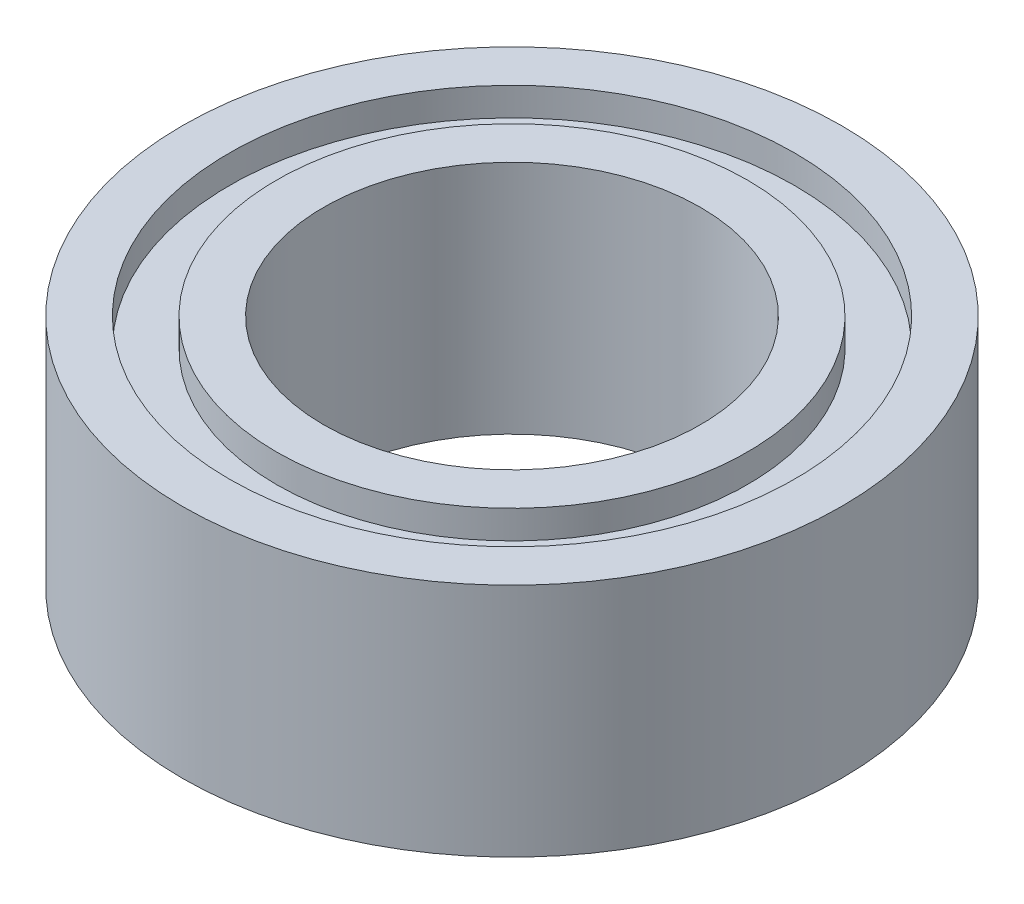
ISO-10303-21;
HEADER;
FILE_DESCRIPTION(('STEP AP214'),'2;1');
FILE_NAME('part.step','',(''),(''),'','','');
FILE_SCHEMA(('AUTOMOTIVE_DESIGN { 1 0 10303 214 1 1 1 1 }'));
ENDSEC;
DATA;
#1=APPLICATION_CONTEXT('core data for automotive mechanical design processes');
#2=APPLICATION_PROTOCOL_DEFINITION('international standard','automotive_design',2000,#1);
#3=PRODUCT_CONTEXT('',#1,'mechanical');
#4=PRODUCT('Part','Part','',(#3));
#5=PRODUCT_RELATED_PRODUCT_CATEGORY('part','',(#4));
#6=PRODUCT_DEFINITION_FORMATION('','',#4);
#7=PRODUCT_DEFINITION_CONTEXT('part definition',#1,'design');
#8=PRODUCT_DEFINITION('design','',#6,#7);
#9=PRODUCT_DEFINITION_SHAPE('','',#8);
#10=(LENGTH_UNIT() NAMED_UNIT(*) SI_UNIT(.MILLI.,.METRE.));
#11=(NAMED_UNIT(*) PLANE_ANGLE_UNIT() SI_UNIT($,.RADIAN.));
#12=(NAMED_UNIT(*) SI_UNIT($,.STERADIAN.) SOLID_ANGLE_UNIT());
#13=UNCERTAINTY_MEASURE_WITH_UNIT(LENGTH_MEASURE(1.E-05),#10,'distance_accuracy_value','');
#14=(GEOMETRIC_REPRESENTATION_CONTEXT(3) GLOBAL_UNCERTAINTY_ASSIGNED_CONTEXT((#13)) GLOBAL_UNIT_ASSIGNED_CONTEXT((#10,
#11,#12)) REPRESENTATION_CONTEXT('',''));
#15=CARTESIAN_POINT('',(0.,0.,0.));
#16=DIRECTION('',(0.,0.,1.));
#17=DIRECTION('',(1.,0.,0.));
#18=AXIS2_PLACEMENT_3D('',#15,#16,#17);
#19=CARTESIAN_POINT('',(2.5,0.,0.));
#20=DIRECTION('',(0.,1.,0.));
#21=DIRECTION('',(0.,0.,1.));
#22=AXIS2_PLACEMENT_3D('',#19,#20,#21);
#23=PLANE('',#22);
#24=CARTESIAN_POINT('',(0.,0.,0.));
#25=DIRECTION('',(0.,1.,0.));
#26=DIRECTION('',(0.,0.,1.));
#27=AXIS2_PLACEMENT_3D('',#24,#25,#26);
#28=CIRCLE('',#27,2.5);
#29=CARTESIAN_POINT('',(0.,0.,2.5));
#30=VERTEX_POINT('',#29);
#31=EDGE_CURVE('E90',#30,#30,#28,.T.);
#32=ORIENTED_EDGE('',*,*,#31,.F.);
#33=EDGE_LOOP('',(#32));
#34=FACE_BOUND('',#33,.T.);
#35=CARTESIAN_POINT('',(0.,0.,0.));
#36=DIRECTION('',(0.,1.,0.));
#37=DIRECTION('',(0.,0.,1.));
#38=AXIS2_PLACEMENT_3D('',#35,#36,#37);
#39=CIRCLE('',#38,2.);
#40=CARTESIAN_POINT('',(0.,0.,2.));
#41=VERTEX_POINT('',#40);
#42=EDGE_CURVE('E10',#41,#41,#39,.T.);
#43=ORIENTED_EDGE('',*,*,#42,.T.);
#44=EDGE_LOOP('',(#43));
#45=FACE_BOUND('',#44,.T.);
#46=ADVANCED_FACE('F39',(#34,#45),#23,.F.);
#47=CARTESIAN_POINT('',(0.,7.96903136687135,0.));
#48=DIRECTION('',(0.,1.,0.));
#49=DIRECTION('',(0.,0.,1.));
#50=AXIS2_PLACEMENT_3D('',#47,#48,#49);
#51=CYLINDRICAL_SURFACE('',#50,2.);
#52=ORIENTED_EDGE('',*,*,#42,.F.);
#53=EDGE_LOOP('',(#52));
#54=FACE_BOUND('',#53,.T.);
#55=CARTESIAN_POINT('',(0.,2.5,0.));
#56=DIRECTION('',(0.,1.,0.));
#57=DIRECTION('',(0.,0.,1.));
#58=AXIS2_PLACEMENT_3D('',#55,#56,#57);
#59=CIRCLE('',#58,2.);
#60=CARTESIAN_POINT('',(0.,2.5,2.));
#61=VERTEX_POINT('',#60);
#62=EDGE_CURVE('E46',#61,#61,#59,.T.);
#63=ORIENTED_EDGE('',*,*,#62,.T.);
#64=EDGE_LOOP('',(#63));
#65=FACE_BOUND('',#64,.T.);
#66=ADVANCED_FACE('F98',(#54,#65),#51,.F.);
#67=CARTESIAN_POINT('',(2.,2.5,0.));
#68=DIRECTION('',(0.,-1.,0.));
#69=DIRECTION('',(0.,0.,-1.));
#70=AXIS2_PLACEMENT_3D('',#67,#68,#69);
#71=PLANE('',#70);
#72=ORIENTED_EDGE('',*,*,#62,.F.);
#73=EDGE_LOOP('',(#72));
#74=FACE_BOUND('',#73,.T.);
#75=CARTESIAN_POINT('',(0.,2.5,0.));
#76=DIRECTION('',(0.,1.,0.));
#77=DIRECTION('',(0.,0.,1.));
#78=AXIS2_PLACEMENT_3D('',#75,#76,#77);
#79=CIRCLE('',#78,2.5);
#80=CARTESIAN_POINT('',(0.,2.5,2.5));
#81=VERTEX_POINT('',#80);
#82=EDGE_CURVE('E51',#81,#81,#79,.T.);
#83=ORIENTED_EDGE('',*,*,#82,.T.);
#84=EDGE_LOOP('',(#83));
#85=FACE_BOUND('',#84,.T.);
#86=ADVANCED_FACE('F102',(#74,#85),#71,.F.);
#87=CARTESIAN_POINT('',(0.,7.96903136687135,0.));
#88=DIRECTION('',(0.,1.,0.));
#89=DIRECTION('',(0.,0.,1.));
#90=AXIS2_PLACEMENT_3D('',#87,#88,#89);
#91=CYLINDRICAL_SURFACE('',#90,2.5);
#92=ORIENTED_EDGE('',*,*,#82,.F.);
#93=EDGE_LOOP('',(#92));
#94=FACE_BOUND('',#93,.T.);
#95=CARTESIAN_POINT('',(0.,2.2,0.));
#96=DIRECTION('',(0.,1.,0.));
#97=DIRECTION('',(0.,0.,1.));
#98=AXIS2_PLACEMENT_3D('',#95,#96,#97);
#99=CIRCLE('',#98,2.5);
#100=CARTESIAN_POINT('',(0.,2.2,2.5));
#101=VERTEX_POINT('',#100);
#102=EDGE_CURVE('E56',#101,#101,#99,.T.);
#103=ORIENTED_EDGE('',*,*,#102,.T.);
#104=EDGE_LOOP('',(#103));
#105=FACE_BOUND('',#104,.T.);
#106=ADVANCED_FACE('F107',(#94,#105),#91,.T.);
#107=CARTESIAN_POINT('',(2.5,2.2,0.));
#108=DIRECTION('',(0.,-1.,0.));
#109=DIRECTION('',(0.,0.,-1.));
#110=AXIS2_PLACEMENT_3D('',#107,#108,#109);
#111=PLANE('',#110);
#112=ORIENTED_EDGE('',*,*,#102,.F.);
#113=EDGE_LOOP('',(#112));
#114=FACE_BOUND('',#113,.T.);
#115=CARTESIAN_POINT('',(0.,2.2,0.));
#116=DIRECTION('',(0.,1.,0.));
#117=DIRECTION('',(0.,0.,1.));
#118=AXIS2_PLACEMENT_3D('',#115,#116,#117);
#119=CIRCLE('',#118,3.);
#120=CARTESIAN_POINT('',(0.,2.2,3.));
#121=VERTEX_POINT('',#120);
#122=EDGE_CURVE('E62',#121,#121,#119,.T.);
#123=ORIENTED_EDGE('',*,*,#122,.T.);
#124=EDGE_LOOP('',(#123));
#125=FACE_BOUND('',#124,.T.);
#126=ADVANCED_FACE('F113',(#114,#125),#111,.F.);
#127=CARTESIAN_POINT('',(0.,7.96903136687135,0.));
#128=DIRECTION('',(0.,1.,0.));
#129=DIRECTION('',(0.,0.,1.));
#130=AXIS2_PLACEMENT_3D('',#127,#128,#129);
#131=CYLINDRICAL_SURFACE('',#130,3.);
#132=ORIENTED_EDGE('',*,*,#122,.F.);
#133=EDGE_LOOP('',(#132));
#134=FACE_BOUND('',#133,.T.);
#135=CARTESIAN_POINT('',(0.,2.5,0.));
#136=DIRECTION('',(0.,1.,0.));
#137=DIRECTION('',(0.,0.,1.));
#138=AXIS2_PLACEMENT_3D('',#135,#136,#137);
#139=CIRCLE('',#138,3.);
#140=CARTESIAN_POINT('',(0.,2.5,3.));
#141=VERTEX_POINT('',#140);
#142=EDGE_CURVE('E66',#141,#141,#139,.T.);
#143=ORIENTED_EDGE('',*,*,#142,.T.);
#144=EDGE_LOOP('',(#143));
#145=FACE_BOUND('',#144,.T.);
#146=ADVANCED_FACE('F117',(#134,#145),#131,.F.);
#147=CARTESIAN_POINT('',(3.,2.5,0.));
#148=DIRECTION('',(0.,-1.,0.));
#149=DIRECTION('',(0.,0.,-1.));
#150=AXIS2_PLACEMENT_3D('',#147,#148,#149);
#151=PLANE('',#150);
#152=ORIENTED_EDGE('',*,*,#142,.F.);
#153=EDGE_LOOP('',(#152));
#154=FACE_BOUND('',#153,.T.);
#155=CARTESIAN_POINT('',(0.,2.5,0.));
#156=DIRECTION('',(0.,1.,0.));
#157=DIRECTION('',(0.,0.,1.));
#158=AXIS2_PLACEMENT_3D('',#155,#156,#157);
#159=CIRCLE('',#158,3.5);
#160=CARTESIAN_POINT('',(0.,2.5,3.5));
#161=VERTEX_POINT('',#160);
#162=EDGE_CURVE('E70',#161,#161,#159,.T.);
#163=ORIENTED_EDGE('',*,*,#162,.T.);
#164=EDGE_LOOP('',(#163));
#165=FACE_BOUND('',#164,.T.);
#166=ADVANCED_FACE('F121',(#154,#165),#151,.F.);
#167=CARTESIAN_POINT('',(0.,7.96903136687135,0.));
#168=DIRECTION('',(0.,1.,0.));
#169=DIRECTION('',(0.,0.,1.));
#170=AXIS2_PLACEMENT_3D('',#167,#168,#169);
#171=CYLINDRICAL_SURFACE('',#170,3.5);
#172=ORIENTED_EDGE('',*,*,#162,.F.);
#173=EDGE_LOOP('',(#172));
#174=FACE_BOUND('',#173,.T.);
#175=CARTESIAN_POINT('',(0.,0.,0.));
#176=DIRECTION('',(0.,1.,0.));
#177=DIRECTION('',(0.,0.,1.));
#178=AXIS2_PLACEMENT_3D('',#175,#176,#177);
#179=CIRCLE('',#178,3.5);
#180=CARTESIAN_POINT('',(0.,0.,3.5));
#181=VERTEX_POINT('',#180);
#182=EDGE_CURVE('E74',#181,#181,#179,.T.);
#183=ORIENTED_EDGE('',*,*,#182,.T.);
#184=EDGE_LOOP('',(#183));
#185=FACE_BOUND('',#184,.T.);
#186=ADVANCED_FACE('F125',(#174,#185),#171,.T.);
#187=CARTESIAN_POINT('',(3.5,0.,0.));
#188=DIRECTION('',(0.,1.,0.));
#189=DIRECTION('',(0.,0.,1.));
#190=AXIS2_PLACEMENT_3D('',#187,#188,#189);
#191=PLANE('',#190);
#192=ORIENTED_EDGE('',*,*,#182,.F.);
#193=EDGE_LOOP('',(#192));
#194=FACE_BOUND('',#193,.T.);
#195=CARTESIAN_POINT('',(0.,0.,0.));
#196=DIRECTION('',(0.,1.,0.));
#197=DIRECTION('',(0.,0.,1.));
#198=AXIS2_PLACEMENT_3D('',#195,#196,#197);
#199=CIRCLE('',#198,3.);
#200=CARTESIAN_POINT('',(0.,0.,3.));
#201=VERTEX_POINT('',#200);
#202=EDGE_CURVE('E78',#201,#201,#199,.T.);
#203=ORIENTED_EDGE('',*,*,#202,.T.);
#204=EDGE_LOOP('',(#203));
#205=FACE_BOUND('',#204,.T.);
#206=ADVANCED_FACE('F129',(#194,#205),#191,.F.);
#207=CARTESIAN_POINT('',(0.,7.96903136687135,0.));
#208=DIRECTION('',(0.,1.,0.));
#209=DIRECTION('',(0.,0.,1.));
#210=AXIS2_PLACEMENT_3D('',#207,#208,#209);
#211=CYLINDRICAL_SURFACE('',#210,3.);
#212=ORIENTED_EDGE('',*,*,#202,.F.);
#213=EDGE_LOOP('',(#212));
#214=FACE_BOUND('',#213,.T.);
#215=CARTESIAN_POINT('',(0.,0.3,0.));
#216=DIRECTION('',(0.,1.,0.));
#217=DIRECTION('',(0.,0.,1.));
#218=AXIS2_PLACEMENT_3D('',#215,#216,#217);
#219=CIRCLE('',#218,3.);
#220=CARTESIAN_POINT('',(0.,0.3,3.));
#221=VERTEX_POINT('',#220);
#222=EDGE_CURVE('E82',#221,#221,#219,.T.);
#223=ORIENTED_EDGE('',*,*,#222,.T.);
#224=EDGE_LOOP('',(#223));
#225=FACE_BOUND('',#224,.T.);
#226=ADVANCED_FACE('F133',(#214,#225),#211,.F.);
#227=CARTESIAN_POINT('',(3.,0.3,0.));
#228=DIRECTION('',(0.,1.,0.));
#229=DIRECTION('',(0.,0.,1.));
#230=AXIS2_PLACEMENT_3D('',#227,#228,#229);
#231=PLANE('',#230);
#232=ORIENTED_EDGE('',*,*,#222,.F.);
#233=EDGE_LOOP('',(#232));
#234=FACE_BOUND('',#233,.T.);
#235=CARTESIAN_POINT('',(0.,0.3,0.));
#236=DIRECTION('',(0.,1.,0.));
#237=DIRECTION('',(0.,0.,1.));
#238=AXIS2_PLACEMENT_3D('',#235,#236,#237);
#239=CIRCLE('',#238,2.5);
#240=CARTESIAN_POINT('',(0.,0.3,2.5));
#241=VERTEX_POINT('',#240);
#242=EDGE_CURVE('E86',#241,#241,#239,.T.);
#243=ORIENTED_EDGE('',*,*,#242,.T.);
#244=EDGE_LOOP('',(#243));
#245=FACE_BOUND('',#244,.T.);
#246=ADVANCED_FACE('F137',(#234,#245),#231,.F.);
#247=CARTESIAN_POINT('',(0.,7.96903136687135,0.));
#248=DIRECTION('',(0.,1.,0.));
#249=DIRECTION('',(0.,0.,1.));
#250=AXIS2_PLACEMENT_3D('',#247,#248,#249);
#251=CYLINDRICAL_SURFACE('',#250,2.5);
#252=ORIENTED_EDGE('',*,*,#242,.F.);
#253=EDGE_LOOP('',(#252));
#254=FACE_BOUND('',#253,.T.);
#255=ORIENTED_EDGE('',*,*,#31,.T.);
#256=EDGE_LOOP('',(#255));
#257=FACE_BOUND('',#256,.T.);
#258=ADVANCED_FACE('F95',(#254,#257),#251,.T.);
#259=CLOSED_SHELL('',(#46,#66,#86,#106,#126,#146,#166,#186,#206,#226,#246,#258));
#260=MANIFOLD_SOLID_BREP('B2',#259);
#261=ADVANCED_BREP_SHAPE_REPRESENTATION('',(#18,#260),#14);
#262=SHAPE_DEFINITION_REPRESENTATION(#9,#261);
ENDSEC;
END-ISO-10303-21;
